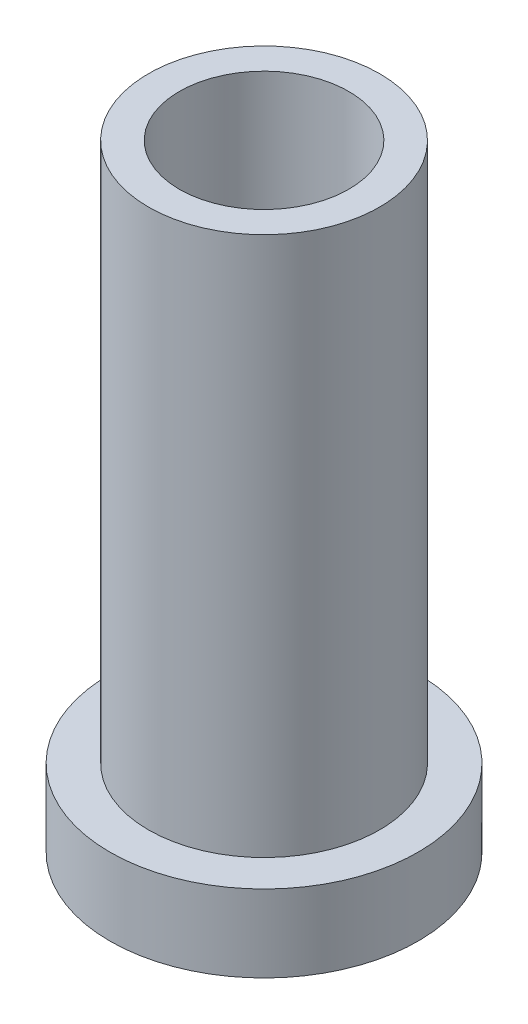
ISO-10303-21;
HEADER;
FILE_DESCRIPTION(('STEP AP214'),'2;1');
FILE_NAME('part.step','',(''),(''),'','','');
FILE_SCHEMA(('AUTOMOTIVE_DESIGN { 1 0 10303 214 1 1 1 1 }'));
ENDSEC;
DATA;
#1=APPLICATION_CONTEXT('core data for automotive mechanical design processes');
#2=APPLICATION_PROTOCOL_DEFINITION('international standard','automotive_design',2000,#1);
#3=PRODUCT_CONTEXT('',#1,'mechanical');
#4=PRODUCT('Part','Part','',(#3));
#5=PRODUCT_RELATED_PRODUCT_CATEGORY('part','',(#4));
#6=PRODUCT_DEFINITION_FORMATION('','',#4);
#7=PRODUCT_DEFINITION_CONTEXT('part definition',#1,'design');
#8=PRODUCT_DEFINITION('design','',#6,#7);
#9=PRODUCT_DEFINITION_SHAPE('','',#8);
#10=(LENGTH_UNIT() NAMED_UNIT(*) SI_UNIT(.MILLI.,.METRE.));
#11=(NAMED_UNIT(*) PLANE_ANGLE_UNIT() SI_UNIT($,.RADIAN.));
#12=(NAMED_UNIT(*) SI_UNIT($,.STERADIAN.) SOLID_ANGLE_UNIT());
#13=UNCERTAINTY_MEASURE_WITH_UNIT(LENGTH_MEASURE(1.E-05),#10,'distance_accuracy_value','');
#14=(GEOMETRIC_REPRESENTATION_CONTEXT(3) GLOBAL_UNCERTAINTY_ASSIGNED_CONTEXT((#13)) GLOBAL_UNIT_ASSIGNED_CONTEXT((#10,
#11,#12)) REPRESENTATION_CONTEXT('',''));
#15=CARTESIAN_POINT('',(0.,0.,0.));
#16=DIRECTION('',(0.,0.,1.));
#17=DIRECTION('',(1.,0.,0.));
#18=AXIS2_PLACEMENT_3D('',#15,#16,#17);
#19=CARTESIAN_POINT('',(0.,5.,0.));
#20=DIRECTION('',(0.,-1.,0.));
#21=DIRECTION('',(0.,0.,-1.));
#22=AXIS2_PLACEMENT_3D('',#19,#20,#21);
#23=CYLINDRICAL_SURFACE('',#22,10.);
#24=CARTESIAN_POINT('',(0.,5.,0.));
#25=DIRECTION('',(0.,1.,0.));
#26=DIRECTION('',(0.,0.,1.));
#27=AXIS2_PLACEMENT_3D('',#24,#25,#26);
#28=CIRCLE('',#27,10.);
#29=CARTESIAN_POINT('',(0.,5.,10.));
#30=VERTEX_POINT('',#29);
#31=EDGE_CURVE('E10',#30,#30,#28,.T.);
#32=ORIENTED_EDGE('',*,*,#31,.F.);
#33=EDGE_LOOP('',(#32));
#34=FACE_BOUND('',#33,.T.);
#35=CARTESIAN_POINT('',(0.,0.,0.));
#36=DIRECTION('',(0.,1.,0.));
#37=DIRECTION('',(0.,0.,1.));
#38=AXIS2_PLACEMENT_3D('',#35,#36,#37);
#39=CIRCLE('',#38,10.);
#40=CARTESIAN_POINT('',(0.,0.,10.));
#41=VERTEX_POINT('',#40);
#42=EDGE_CURVE('E38',#41,#41,#39,.T.);
#43=ORIENTED_EDGE('',*,*,#42,.T.);
#44=EDGE_LOOP('',(#43));
#45=FACE_BOUND('',#44,.T.);
#46=ADVANCED_FACE('F35',(#34,#45),#23,.T.);
#47=CARTESIAN_POINT('',(0.,5.,0.));
#48=DIRECTION('',(0.,1.,0.));
#49=DIRECTION('',(0.,0.,1.));
#50=AXIS2_PLACEMENT_3D('',#47,#48,#49);
#51=PLANE('',#50);
#52=CARTESIAN_POINT('',(0.,5.,0.));
#53=DIRECTION('',(0.,1.,0.));
#54=DIRECTION('',(0.,0.,1.));
#55=AXIS2_PLACEMENT_3D('',#52,#53,#54);
#56=CIRCLE('',#55,7.5);
#57=CARTESIAN_POINT('',(0.,5.,7.5));
#58=VERTEX_POINT('',#57);
#59=EDGE_CURVE('E42',#58,#58,#56,.T.);
#60=ORIENTED_EDGE('',*,*,#59,.F.);
#61=EDGE_LOOP('',(#60));
#62=FACE_BOUND('',#61,.T.);
#63=ORIENTED_EDGE('',*,*,#31,.T.);
#64=EDGE_LOOP('',(#63));
#65=FACE_BOUND('',#64,.T.);
#66=ADVANCED_FACE('F77',(#62,#65),#51,.T.);
#67=CARTESIAN_POINT('',(0.,0.,0.));
#68=DIRECTION('',(0.,1.,0.));
#69=DIRECTION('',(0.,0.,1.));
#70=AXIS2_PLACEMENT_3D('',#67,#68,#69);
#71=PLANE('',#70);
#72=ORIENTED_EDGE('',*,*,#42,.F.);
#73=EDGE_LOOP('',(#72));
#74=FACE_BOUND('',#73,.T.);
#75=CARTESIAN_POINT('',(0.,0.,0.));
#76=DIRECTION('',(0.,1.,0.));
#77=DIRECTION('',(0.,0.,1.));
#78=AXIS2_PLACEMENT_3D('',#75,#76,#77);
#79=CIRCLE('',#78,5.5);
#80=CARTESIAN_POINT('',(0.,0.,5.5));
#81=VERTEX_POINT('',#80);
#82=EDGE_CURVE('E48',#81,#81,#79,.T.);
#83=ORIENTED_EDGE('',*,*,#82,.T.);
#84=EDGE_LOOP('',(#83));
#85=FACE_BOUND('',#84,.T.);
#86=ADVANCED_FACE('F74',(#74,#85),#71,.F.);
#87=CARTESIAN_POINT('',(0.,40.,0.));
#88=DIRECTION('',(0.,-1.,0.));
#89=DIRECTION('',(0.,0.,-1.));
#90=AXIS2_PLACEMENT_3D('',#87,#88,#89);
#91=CYLINDRICAL_SURFACE('',#90,5.5);
#92=CARTESIAN_POINT('',(0.,40.,0.));
#93=DIRECTION('',(0.,1.,0.));
#94=DIRECTION('',(0.,0.,1.));
#95=AXIS2_PLACEMENT_3D('',#92,#93,#94);
#96=CIRCLE('',#95,5.5);
#97=CARTESIAN_POINT('',(0.,40.,5.5));
#98=VERTEX_POINT('',#97);
#99=EDGE_CURVE('E51',#98,#98,#96,.T.);
#100=ORIENTED_EDGE('',*,*,#99,.T.);
#101=EDGE_LOOP('',(#100));
#102=FACE_BOUND('',#101,.T.);
#103=ORIENTED_EDGE('',*,*,#82,.F.);
#104=EDGE_LOOP('',(#103));
#105=FACE_BOUND('',#104,.T.);
#106=ADVANCED_FACE('F58',(#102,#105),#91,.F.);
#107=CARTESIAN_POINT('',(0.,40.,0.));
#108=DIRECTION('',(0.,-1.,0.));
#109=DIRECTION('',(0.,0.,-1.));
#110=AXIS2_PLACEMENT_3D('',#107,#108,#109);
#111=CYLINDRICAL_SURFACE('',#110,7.5);
#112=ORIENTED_EDGE('',*,*,#59,.T.);
#113=EDGE_LOOP('',(#112));
#114=FACE_BOUND('',#113,.T.);
#115=CARTESIAN_POINT('',(0.,40.,0.));
#116=DIRECTION('',(0.,1.,0.));
#117=DIRECTION('',(0.,0.,1.));
#118=AXIS2_PLACEMENT_3D('',#115,#116,#117);
#119=CIRCLE('',#118,7.5);
#120=CARTESIAN_POINT('',(0.,40.,7.5));
#121=VERTEX_POINT('',#120);
#122=EDGE_CURVE('E52',#121,#121,#119,.T.);
#123=ORIENTED_EDGE('',*,*,#122,.F.);
#124=EDGE_LOOP('',(#123));
#125=FACE_BOUND('',#124,.T.);
#126=ADVANCED_FACE('F64',(#114,#125),#111,.T.);
#127=CARTESIAN_POINT('',(0.,40.,0.));
#128=DIRECTION('',(0.,1.,0.));
#129=DIRECTION('',(0.,0.,1.));
#130=AXIS2_PLACEMENT_3D('',#127,#128,#129);
#131=PLANE('',#130);
#132=ORIENTED_EDGE('',*,*,#99,.F.);
#133=EDGE_LOOP('',(#132));
#134=FACE_BOUND('',#133,.T.);
#135=ORIENTED_EDGE('',*,*,#122,.T.);
#136=EDGE_LOOP('',(#135));
#137=FACE_BOUND('',#136,.T.);
#138=ADVANCED_FACE('F61',(#134,#137),#131,.T.);
#139=CLOSED_SHELL('',(#46,#66,#86,#106,#126,#138));
#140=MANIFOLD_SOLID_BREP('B2',#139);
#141=ADVANCED_BREP_SHAPE_REPRESENTATION('',(#18,#140),#14);
#142=SHAPE_DEFINITION_REPRESENTATION(#9,#141);
ENDSEC;
END-ISO-10303-21;
